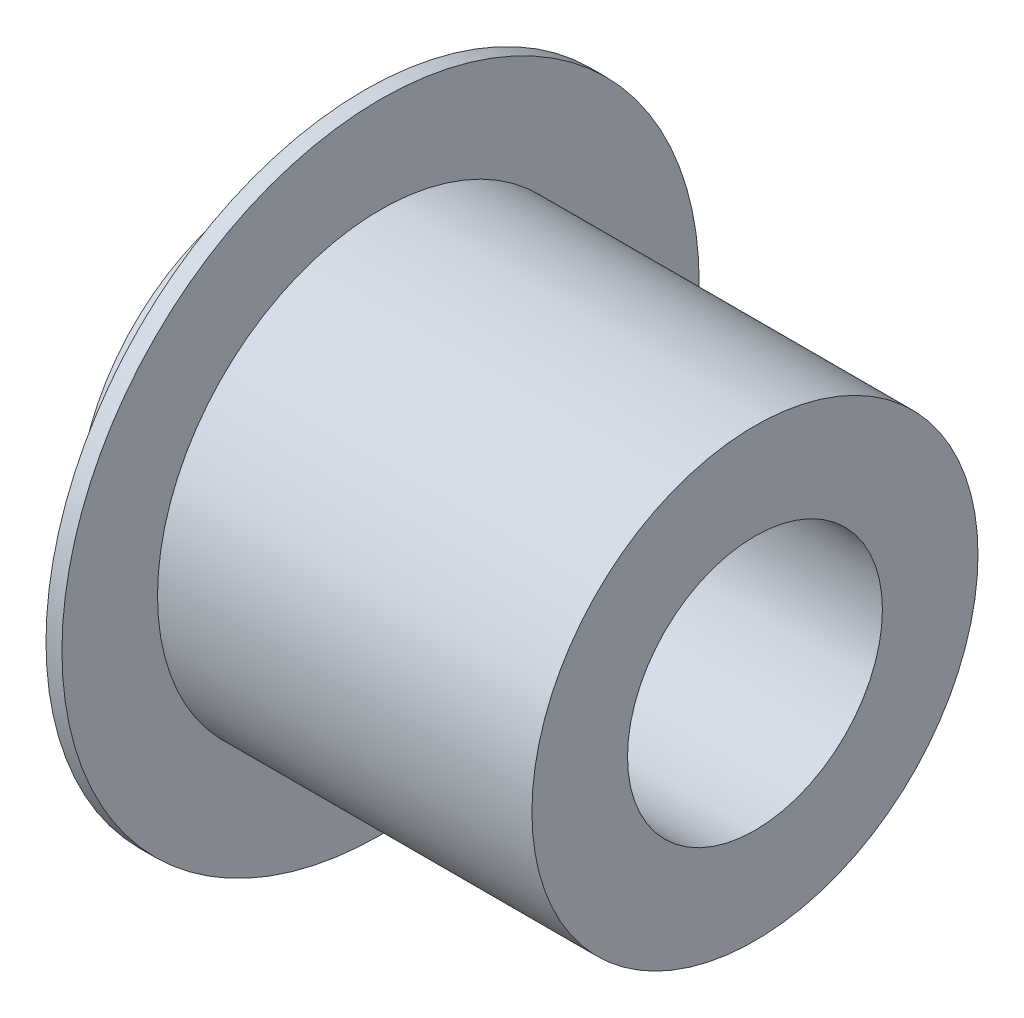
ISO-10303-21;
HEADER;
FILE_DESCRIPTION(('STEP AP214'),'2;1');
FILE_NAME('part.step','',(''),(''),'','','');
FILE_SCHEMA(('AUTOMOTIVE_DESIGN { 1 0 10303 214 1 1 1 1 }'));
ENDSEC;
DATA;
#1=APPLICATION_CONTEXT('core data for automotive mechanical design processes');
#2=APPLICATION_PROTOCOL_DEFINITION('international standard','automotive_design',2000,#1);
#3=PRODUCT_CONTEXT('',#1,'mechanical');
#4=PRODUCT('Part','Part','',(#3));
#5=PRODUCT_RELATED_PRODUCT_CATEGORY('part','',(#4));
#6=PRODUCT_DEFINITION_FORMATION('','',#4);
#7=PRODUCT_DEFINITION_CONTEXT('part definition',#1,'design');
#8=PRODUCT_DEFINITION('design','',#6,#7);
#9=PRODUCT_DEFINITION_SHAPE('','',#8);
#10=(LENGTH_UNIT() NAMED_UNIT(*) SI_UNIT(.MILLI.,.METRE.));
#11=(NAMED_UNIT(*) PLANE_ANGLE_UNIT() SI_UNIT($,.RADIAN.));
#12=(NAMED_UNIT(*) SI_UNIT($,.STERADIAN.) SOLID_ANGLE_UNIT());
#13=UNCERTAINTY_MEASURE_WITH_UNIT(LENGTH_MEASURE(1.E-05),#10,'distance_accuracy_value','');
#14=(GEOMETRIC_REPRESENTATION_CONTEXT(3) GLOBAL_UNCERTAINTY_ASSIGNED_CONTEXT((#13)) GLOBAL_UNIT_ASSIGNED_CONTEXT((#10,
#11,#12)) REPRESENTATION_CONTEXT('',''));
#15=CARTESIAN_POINT('',(0.,0.,0.));
#16=DIRECTION('',(0.,0.,1.));
#17=DIRECTION('',(1.,0.,0.));
#18=AXIS2_PLACEMENT_3D('',#15,#16,#17);
#19=CARTESIAN_POINT('',(-25.3713247602611,0.,0.));
#20=DIRECTION('',(-1.,0.,0.));
#21=DIRECTION('',(0.,0.,1.));
#22=AXIS2_PLACEMENT_3D('',#19,#20,#21);
#23=CYLINDRICAL_SURFACE('',#22,12.);
#24=CARTESIAN_POINT('',(0.,0.,0.));
#25=DIRECTION('',(-1.,0.,0.));
#26=DIRECTION('',(0.,0.,1.));
#27=AXIS2_PLACEMENT_3D('',#24,#25,#26);
#28=CIRCLE('',#27,12.);
#29=CARTESIAN_POINT('',(0.,0.,12.));
#30=VERTEX_POINT('',#29);
#31=EDGE_CURVE('E10',#30,#30,#28,.T.);
#32=ORIENTED_EDGE('',*,*,#31,.F.);
#33=EDGE_LOOP('',(#32));
#34=FACE_BOUND('',#33,.T.);
#35=CARTESIAN_POINT('',(0.999999999999997,0.,0.));
#36=DIRECTION('',(-1.,0.,0.));
#37=DIRECTION('',(0.,0.,1.));
#38=AXIS2_PLACEMENT_3D('',#35,#36,#37);
#39=CIRCLE('',#38,12.);
#40=CARTESIAN_POINT('',(0.999999999999997,0.,12.));
#41=VERTEX_POINT('',#40);
#42=EDGE_CURVE('E80',#41,#41,#39,.T.);
#43=ORIENTED_EDGE('',*,*,#42,.T.);
#44=EDGE_LOOP('',(#43));
#45=FACE_BOUND('',#44,.T.);
#46=ADVANCED_FACE('F37',(#34,#45),#23,.T.);
#47=CARTESIAN_POINT('',(0.,8.,0.));
#48=DIRECTION('',(1.,0.,0.));
#49=DIRECTION('',(0.,0.,-1.));
#50=AXIS2_PLACEMENT_3D('',#47,#48,#49);
#51=PLANE('',#50);
#52=CARTESIAN_POINT('',(0.,0.,0.));
#53=DIRECTION('',(-1.,0.,0.));
#54=DIRECTION('',(0.,0.,1.));
#55=AXIS2_PLACEMENT_3D('',#52,#53,#54);
#56=CIRCLE('',#55,8.);
#57=CARTESIAN_POINT('',(0.,0.,8.));
#58=VERTEX_POINT('',#57);
#59=EDGE_CURVE('E44',#58,#58,#56,.T.);
#60=ORIENTED_EDGE('',*,*,#59,.F.);
#61=EDGE_LOOP('',(#60));
#62=FACE_BOUND('',#61,.T.);
#63=ORIENTED_EDGE('',*,*,#31,.T.);
#64=EDGE_LOOP('',(#63));
#65=FACE_BOUND('',#64,.T.);
#66=ADVANCED_FACE('F130',(#62,#65),#51,.F.);
#67=CARTESIAN_POINT('',(-25.3713247602611,0.,0.));
#68=DIRECTION('',(-1.,0.,0.));
#69=DIRECTION('',(0.,0.,1.));
#70=AXIS2_PLACEMENT_3D('',#67,#68,#69);
#71=CYLINDRICAL_SURFACE('',#70,8.);
#72=CARTESIAN_POINT('',(30.5,0.,0.));
#73=DIRECTION('',(-1.,0.,0.));
#74=DIRECTION('',(0.,0.,1.));
#75=AXIS2_PLACEMENT_3D('',#72,#73,#74);
#76=CIRCLE('',#75,8.);
#77=CARTESIAN_POINT('',(30.5,0.,8.));
#78=VERTEX_POINT('',#77);
#79=EDGE_CURVE('E49',#78,#78,#76,.T.);
#80=ORIENTED_EDGE('',*,*,#79,.F.);
#81=EDGE_LOOP('',(#80));
#82=FACE_BOUND('',#81,.T.);
#83=ORIENTED_EDGE('',*,*,#59,.T.);
#84=EDGE_LOOP('',(#83));
#85=FACE_BOUND('',#84,.T.);
#86=ADVANCED_FACE('F125',(#82,#85),#71,.F.);
#87=CARTESIAN_POINT('',(30.5,14.,0.));
#88=DIRECTION('',(-1.,0.,0.));
#89=DIRECTION('',(0.,0.,1.));
#90=AXIS2_PLACEMENT_3D('',#87,#88,#89);
#91=PLANE('',#90);
#92=CARTESIAN_POINT('',(30.5,0.,0.));
#93=DIRECTION('',(-1.,0.,0.));
#94=DIRECTION('',(0.,0.,1.));
#95=AXIS2_PLACEMENT_3D('',#92,#93,#94);
#96=CIRCLE('',#95,14.);
#97=CARTESIAN_POINT('',(30.5,0.,14.));
#98=VERTEX_POINT('',#97);
#99=EDGE_CURVE('E54',#98,#98,#96,.T.);
#100=ORIENTED_EDGE('',*,*,#99,.F.);
#101=EDGE_LOOP('',(#100));
#102=FACE_BOUND('',#101,.T.);
#103=ORIENTED_EDGE('',*,*,#79,.T.);
#104=EDGE_LOOP('',(#103));
#105=FACE_BOUND('',#104,.T.);
#106=ADVANCED_FACE('F119',(#102,#105),#91,.F.);
#107=CARTESIAN_POINT('',(-25.3713247602611,0.,0.));
#108=DIRECTION('',(-1.,0.,0.));
#109=DIRECTION('',(0.,0.,1.));
#110=AXIS2_PLACEMENT_3D('',#107,#108,#109);
#111=CYLINDRICAL_SURFACE('',#110,14.);
#112=CARTESIAN_POINT('',(6.99999999999999,0.,0.));
#113=DIRECTION('',(-1.,0.,0.));
#114=DIRECTION('',(0.,0.,1.));
#115=AXIS2_PLACEMENT_3D('',#112,#113,#114);
#116=CIRCLE('',#115,14.);
#117=CARTESIAN_POINT('',(6.99999999999999,0.,14.));
#118=VERTEX_POINT('',#117);
#119=EDGE_CURVE('E60',#118,#118,#116,.T.);
#120=ORIENTED_EDGE('',*,*,#119,.F.);
#121=EDGE_LOOP('',(#120));
#122=FACE_BOUND('',#121,.T.);
#123=ORIENTED_EDGE('',*,*,#99,.T.);
#124=EDGE_LOOP('',(#123));
#125=FACE_BOUND('',#124,.T.);
#126=ADVANCED_FACE('F113',(#122,#125),#111,.T.);
#127=CARTESIAN_POINT('',(7.,20.,0.));
#128=DIRECTION('',(-1.,0.,0.));
#129=DIRECTION('',(0.,0.,1.));
#130=AXIS2_PLACEMENT_3D('',#127,#128,#129);
#131=PLANE('',#130);
#132=CARTESIAN_POINT('',(7.,0.,0.));
#133=DIRECTION('',(-1.,0.,0.));
#134=DIRECTION('',(0.,0.,1.));
#135=AXIS2_PLACEMENT_3D('',#132,#133,#134);
#136=CIRCLE('',#135,20.);
#137=CARTESIAN_POINT('',(7.,0.,20.));
#138=VERTEX_POINT('',#137);
#139=EDGE_CURVE('E64',#138,#138,#136,.T.);
#140=ORIENTED_EDGE('',*,*,#139,.F.);
#141=EDGE_LOOP('',(#140));
#142=FACE_BOUND('',#141,.T.);
#143=ORIENTED_EDGE('',*,*,#119,.T.);
#144=EDGE_LOOP('',(#143));
#145=FACE_BOUND('',#144,.T.);
#146=ADVANCED_FACE('F107',(#142,#145),#131,.F.);
#147=CARTESIAN_POINT('',(-25.3713247602611,0.,0.));
#148=DIRECTION('',(-1.,0.,0.));
#149=DIRECTION('',(0.,0.,1.));
#150=AXIS2_PLACEMENT_3D('',#147,#148,#149);
#151=CYLINDRICAL_SURFACE('',#150,20.);
#152=CARTESIAN_POINT('',(6.,0.,0.));
#153=DIRECTION('',(-1.,0.,0.));
#154=DIRECTION('',(0.,0.,1.));
#155=AXIS2_PLACEMENT_3D('',#152,#153,#154);
#156=CIRCLE('',#155,20.);
#157=CARTESIAN_POINT('',(6.,0.,20.));
#158=VERTEX_POINT('',#157);
#159=EDGE_CURVE('E68',#158,#158,#156,.T.);
#160=ORIENTED_EDGE('',*,*,#159,.F.);
#161=EDGE_LOOP('',(#160));
#162=FACE_BOUND('',#161,.T.);
#163=ORIENTED_EDGE('',*,*,#139,.T.);
#164=EDGE_LOOP('',(#163));
#165=FACE_BOUND('',#164,.T.);
#166=ADVANCED_FACE('F101',(#162,#165),#151,.T.);
#167=CARTESIAN_POINT('',(6.,14.,0.));
#168=DIRECTION('',(1.,0.,0.));
#169=DIRECTION('',(0.,0.,-1.));
#170=AXIS2_PLACEMENT_3D('',#167,#168,#169);
#171=PLANE('',#170);
#172=CARTESIAN_POINT('',(5.99999999999999,0.,0.));
#173=DIRECTION('',(-1.,0.,0.));
#174=DIRECTION('',(0.,0.,1.));
#175=AXIS2_PLACEMENT_3D('',#172,#173,#174);
#176=CIRCLE('',#175,14.);
#177=CARTESIAN_POINT('',(5.99999999999999,0.,14.));
#178=VERTEX_POINT('',#177);
#179=EDGE_CURVE('E72',#178,#178,#176,.T.);
#180=ORIENTED_EDGE('',*,*,#179,.F.);
#181=EDGE_LOOP('',(#180));
#182=FACE_BOUND('',#181,.T.);
#183=ORIENTED_EDGE('',*,*,#159,.T.);
#184=EDGE_LOOP('',(#183));
#185=FACE_BOUND('',#184,.T.);
#186=ADVANCED_FACE('F95',(#182,#185),#171,.F.);
#187=CARTESIAN_POINT('',(-25.3713247602611,0.,0.));
#188=DIRECTION('',(-1.,0.,0.));
#189=DIRECTION('',(0.,0.,1.));
#190=AXIS2_PLACEMENT_3D('',#187,#188,#189);
#191=CYLINDRICAL_SURFACE('',#190,14.);
#192=CARTESIAN_POINT('',(2.99999999999999,0.,0.));
#193=DIRECTION('',(-1.,0.,0.));
#194=DIRECTION('',(0.,0.,1.));
#195=AXIS2_PLACEMENT_3D('',#192,#193,#194);
#196=CIRCLE('',#195,14.);
#197=CARTESIAN_POINT('',(2.99999999999999,0.,14.));
#198=VERTEX_POINT('',#197);
#199=EDGE_CURVE('E76',#198,#198,#196,.T.);
#200=ORIENTED_EDGE('',*,*,#199,.F.);
#201=EDGE_LOOP('',(#200));
#202=FACE_BOUND('',#201,.T.);
#203=ORIENTED_EDGE('',*,*,#179,.T.);
#204=EDGE_LOOP('',(#203));
#205=FACE_BOUND('',#204,.T.);
#206=ADVANCED_FACE('F89',(#202,#205),#191,.T.);
#207=CARTESIAN_POINT('',(2.99999999999999,0.,0.));
#208=DIRECTION('',(1.,0.,0.));
#209=DIRECTION('',(0.,0.,-1.));
#210=AXIS2_PLACEMENT_3D('',#207,#208,#209);
#211=CONICAL_SURFACE('',#210,14.,0.78539816339745);
#212=ORIENTED_EDGE('',*,*,#42,.F.);
#213=EDGE_LOOP('',(#212));
#214=FACE_BOUND('',#213,.T.);
#215=ORIENTED_EDGE('',*,*,#199,.T.);
#216=EDGE_LOOP('',(#215));
#217=FACE_BOUND('',#216,.T.);
#218=ADVANCED_FACE('F86',(#214,#217),#211,.T.);
#219=CLOSED_SHELL('',(#46,#66,#86,#106,#126,#146,#166,#186,#206,#218));
#220=MANIFOLD_SOLID_BREP('B2',#219);
#221=ADVANCED_BREP_SHAPE_REPRESENTATION('',(#18,#220),#14);
#222=SHAPE_DEFINITION_REPRESENTATION(#9,#221);
ENDSEC;
END-ISO-10303-21;
